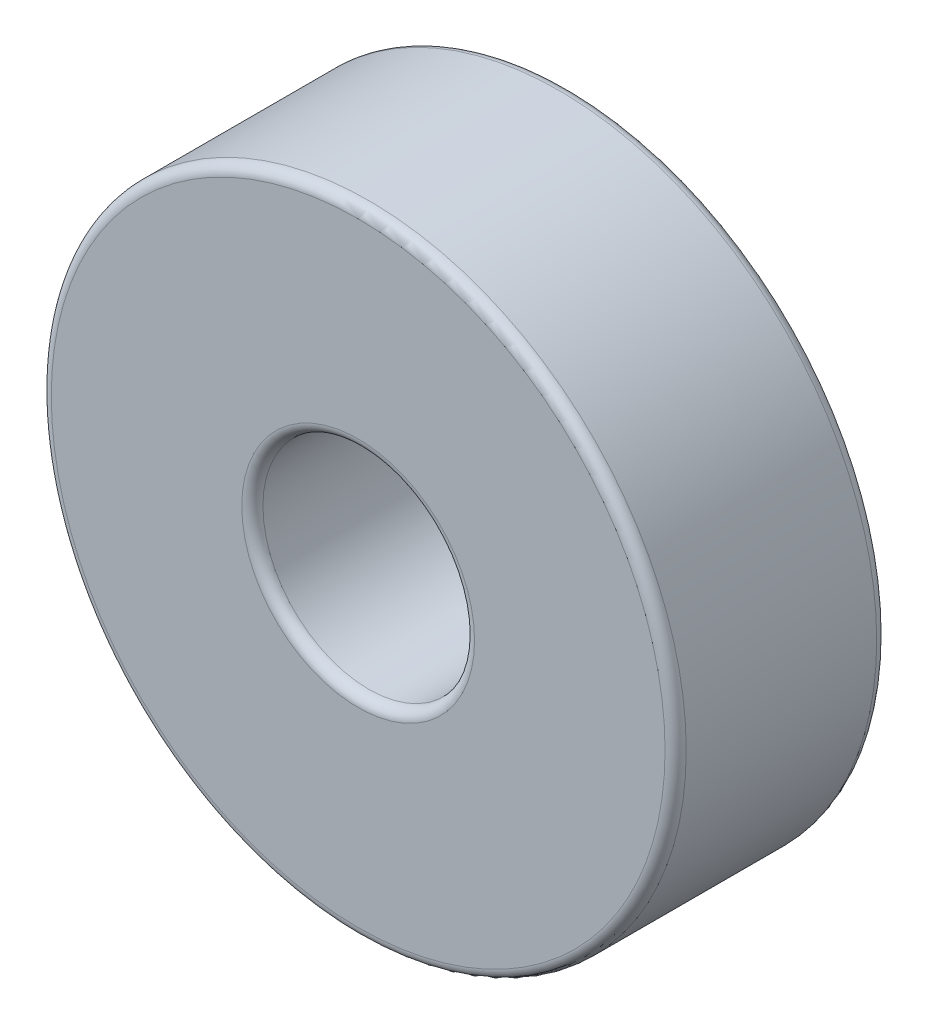
ISO-10303-21;
HEADER;
FILE_DESCRIPTION(('STEP AP214'),'2;1');
FILE_NAME('part.step','',(''),(''),'','','');
FILE_SCHEMA(('AUTOMOTIVE_DESIGN { 1 0 10303 214 1 1 1 1 }'));
ENDSEC;
DATA;
#1=APPLICATION_CONTEXT('core data for automotive mechanical design processes');
#2=APPLICATION_PROTOCOL_DEFINITION('international standard','automotive_design',2000,#1);
#3=PRODUCT_CONTEXT('',#1,'mechanical');
#4=PRODUCT('Part','Part','',(#3));
#5=PRODUCT_RELATED_PRODUCT_CATEGORY('part','',(#4));
#6=PRODUCT_DEFINITION_FORMATION('','',#4);
#7=PRODUCT_DEFINITION_CONTEXT('part definition',#1,'design');
#8=PRODUCT_DEFINITION('design','',#6,#7);
#9=PRODUCT_DEFINITION_SHAPE('','',#8);
#10=(LENGTH_UNIT() NAMED_UNIT(*) SI_UNIT(.MILLI.,.METRE.));
#11=(NAMED_UNIT(*) PLANE_ANGLE_UNIT() SI_UNIT($,.RADIAN.));
#12=(NAMED_UNIT(*) SI_UNIT($,.STERADIAN.) SOLID_ANGLE_UNIT());
#13=UNCERTAINTY_MEASURE_WITH_UNIT(LENGTH_MEASURE(1.E-05),#10,'distance_accuracy_value','');
#14=(GEOMETRIC_REPRESENTATION_CONTEXT(3) GLOBAL_UNCERTAINTY_ASSIGNED_CONTEXT((#13)) GLOBAL_UNIT_ASSIGNED_CONTEXT((#10,
#11,#12)) REPRESENTATION_CONTEXT('',''));
#15=CARTESIAN_POINT('',(0.,0.,0.));
#16=DIRECTION('',(0.,0.,1.));
#17=DIRECTION('',(1.,0.,0.));
#18=AXIS2_PLACEMENT_3D('',#15,#16,#17);
#19=CARTESIAN_POINT('',(0.,0.,3.));
#20=DIRECTION('',(0.,0.,1.));
#21=DIRECTION('',(1.,0.,0.));
#22=AXIS2_PLACEMENT_3D('',#19,#20,#21);
#23=PLANE('',#22);
#24=CARTESIAN_POINT('',(0.,0.,3.));
#25=DIRECTION('',(0.,0.,1.));
#26=DIRECTION('',(1.,0.,0.));
#27=AXIS2_PLACEMENT_3D('',#24,#25,#26);
#28=CIRCLE('',#27,1.65);
#29=CARTESIAN_POINT('',(1.65,0.,3.));
#30=VERTEX_POINT('',#29);
#31=EDGE_CURVE('E46',#30,#30,#28,.F.);
#32=ORIENTED_EDGE('',*,*,#31,.T.);
#33=EDGE_LOOP('',(#32));
#34=FACE_BOUND('',#33,.T.);
#35=CARTESIAN_POINT('',(0.,0.,3.));
#36=DIRECTION('',(0.,0.,1.));
#37=DIRECTION('',(1.,0.,0.));
#38=AXIS2_PLACEMENT_3D('',#35,#36,#37);
#39=CIRCLE('',#38,4.35);
#40=CARTESIAN_POINT('',(4.35,0.,3.));
#41=VERTEX_POINT('',#40);
#42=EDGE_CURVE('E50',#41,#41,#39,.T.);
#43=ORIENTED_EDGE('',*,*,#42,.T.);
#44=EDGE_LOOP('',(#43));
#45=FACE_BOUND('',#44,.T.);
#46=ADVANCED_FACE('F35',(#34,#45),#23,.T.);
#47=CARTESIAN_POINT('',(0.,0.,0.));
#48=DIRECTION('',(0.,0.,1.));
#49=DIRECTION('',(1.,0.,0.));
#50=AXIS2_PLACEMENT_3D('',#47,#48,#49);
#51=PLANE('',#50);
#52=CARTESIAN_POINT('',(0.,0.,0.));
#53=DIRECTION('',(0.,0.,1.));
#54=DIRECTION('',(1.,0.,0.));
#55=AXIS2_PLACEMENT_3D('',#52,#53,#54);
#56=CIRCLE('',#55,1.65);
#57=CARTESIAN_POINT('',(1.65,0.,0.));
#58=VERTEX_POINT('',#57);
#59=EDGE_CURVE('E61',#58,#58,#56,.T.);
#60=ORIENTED_EDGE('',*,*,#59,.T.);
#61=EDGE_LOOP('',(#60));
#62=FACE_BOUND('',#61,.T.);
#63=CARTESIAN_POINT('',(0.,0.,0.));
#64=DIRECTION('',(0.,0.,1.));
#65=DIRECTION('',(1.,0.,0.));
#66=AXIS2_PLACEMENT_3D('',#63,#64,#65);
#67=CIRCLE('',#66,4.35);
#68=CARTESIAN_POINT('',(4.35,0.,0.));
#69=VERTEX_POINT('',#68);
#70=EDGE_CURVE('E64',#69,#69,#67,.F.);
#71=ORIENTED_EDGE('',*,*,#70,.T.);
#72=EDGE_LOOP('',(#71));
#73=FACE_BOUND('',#72,.T.);
#74=ADVANCED_FACE('F68',(#62,#73),#51,.F.);
#75=CARTESIAN_POINT('',(0.,0.,3.));
#76=DIRECTION('',(0.,0.,-1.));
#77=DIRECTION('',(-1.,0.,0.));
#78=AXIS2_PLACEMENT_3D('',#75,#76,#77);
#79=CYLINDRICAL_SURFACE('',#78,4.5);
#80=CARTESIAN_POINT('',(0.,0.,0.15));
#81=DIRECTION('',(0.,0.,1.));
#82=DIRECTION('',(1.,0.,0.));
#83=AXIS2_PLACEMENT_3D('',#80,#81,#82);
#84=CIRCLE('',#83,4.5);
#85=CARTESIAN_POINT('',(4.5,0.,0.15));
#86=VERTEX_POINT('',#85);
#87=EDGE_CURVE('E10',#86,#86,#84,.T.);
#88=ORIENTED_EDGE('',*,*,#87,.T.);
#89=EDGE_LOOP('',(#88));
#90=FACE_BOUND('',#89,.T.);
#91=CARTESIAN_POINT('',(0.,0.,2.85));
#92=DIRECTION('',(0.,0.,1.));
#93=DIRECTION('',(1.,0.,0.));
#94=AXIS2_PLACEMENT_3D('',#91,#92,#93);
#95=CIRCLE('',#94,4.5);
#96=CARTESIAN_POINT('',(4.5,0.,2.85));
#97=VERTEX_POINT('',#96);
#98=EDGE_CURVE('E42',#97,#97,#95,.F.);
#99=ORIENTED_EDGE('',*,*,#98,.T.);
#100=EDGE_LOOP('',(#99));
#101=FACE_BOUND('',#100,.T.);
#102=ADVANCED_FACE('F88',(#90,#101),#79,.T.);
#103=CARTESIAN_POINT('',(0.,0.,3.));
#104=DIRECTION('',(0.,0.,-1.));
#105=DIRECTION('',(-1.,0.,0.));
#106=AXIS2_PLACEMENT_3D('',#103,#104,#105);
#107=CYLINDRICAL_SURFACE('',#106,1.5);
#108=CARTESIAN_POINT('',(0.,0.,0.15));
#109=DIRECTION('',(0.,0.,1.));
#110=DIRECTION('',(1.,0.,0.));
#111=AXIS2_PLACEMENT_3D('',#108,#109,#110);
#112=CIRCLE('',#111,1.5);
#113=CARTESIAN_POINT('',(1.5,0.,0.15));
#114=VERTEX_POINT('',#113);
#115=EDGE_CURVE('E55',#114,#114,#112,.F.);
#116=ORIENTED_EDGE('',*,*,#115,.T.);
#117=EDGE_LOOP('',(#116));
#118=FACE_BOUND('',#117,.T.);
#119=CARTESIAN_POINT('',(0.,0.,2.85));
#120=DIRECTION('',(0.,0.,1.));
#121=DIRECTION('',(1.,0.,0.));
#122=AXIS2_PLACEMENT_3D('',#119,#120,#121);
#123=CIRCLE('',#122,1.5);
#124=CARTESIAN_POINT('',(1.5,0.,2.85));
#125=VERTEX_POINT('',#124);
#126=EDGE_CURVE('E58',#125,#125,#123,.T.);
#127=ORIENTED_EDGE('',*,*,#126,.T.);
#128=EDGE_LOOP('',(#127));
#129=FACE_BOUND('',#128,.T.);
#130=ADVANCED_FACE('F93',(#118,#129),#107,.F.);
#131=CARTESIAN_POINT('',(0.,0.,0.15));
#132=DIRECTION('',(0.,0.,1.));
#133=DIRECTION('',(1.,0.,0.));
#134=AXIS2_PLACEMENT_3D('',#131,#132,#133);
#135=TOROIDAL_SURFACE('',#134,1.65,0.15);
#136=ORIENTED_EDGE('',*,*,#115,.F.);
#137=EDGE_LOOP('',(#136));
#138=FACE_BOUND('',#137,.T.);
#139=ORIENTED_EDGE('',*,*,#59,.F.);
#140=EDGE_LOOP('',(#139));
#141=FACE_BOUND('',#140,.T.);
#142=ADVANCED_FACE('F79',(#138,#141),#135,.T.);
#143=CARTESIAN_POINT('',(0.,0.,2.85));
#144=DIRECTION('',(0.,0.,1.));
#145=DIRECTION('',(1.,0.,0.));
#146=AXIS2_PLACEMENT_3D('',#143,#144,#145);
#147=TOROIDAL_SURFACE('',#146,1.65,0.15);
#148=ORIENTED_EDGE('',*,*,#31,.F.);
#149=EDGE_LOOP('',(#148));
#150=FACE_BOUND('',#149,.T.);
#151=ORIENTED_EDGE('',*,*,#126,.F.);
#152=EDGE_LOOP('',(#151));
#153=FACE_BOUND('',#152,.T.);
#154=ADVANCED_FACE('F73',(#150,#153),#147,.T.);
#155=CARTESIAN_POINT('',(0.,0.,0.15));
#156=DIRECTION('',(0.,0.,1.));
#157=DIRECTION('',(1.,0.,0.));
#158=AXIS2_PLACEMENT_3D('',#155,#156,#157);
#159=TOROIDAL_SURFACE('',#158,4.35,0.15);
#160=ORIENTED_EDGE('',*,*,#70,.F.);
#161=EDGE_LOOP('',(#160));
#162=FACE_BOUND('',#161,.T.);
#163=ORIENTED_EDGE('',*,*,#87,.F.);
#164=EDGE_LOOP('',(#163));
#165=FACE_BOUND('',#164,.T.);
#166=ADVANCED_FACE('F70',(#162,#165),#159,.T.);
#167=CARTESIAN_POINT('',(0.,0.,2.85));
#168=DIRECTION('',(0.,0.,1.));
#169=DIRECTION('',(1.,0.,0.));
#170=AXIS2_PLACEMENT_3D('',#167,#168,#169);
#171=TOROIDAL_SURFACE('',#170,4.35,0.15);
#172=ORIENTED_EDGE('',*,*,#98,.F.);
#173=EDGE_LOOP('',(#172));
#174=FACE_BOUND('',#173,.T.);
#175=ORIENTED_EDGE('',*,*,#42,.F.);
#176=EDGE_LOOP('',(#175));
#177=FACE_BOUND('',#176,.T.);
#178=ADVANCED_FACE('F37',(#174,#177),#171,.T.);
#179=CLOSED_SHELL('',(#46,#74,#102,#130,#142,#154,#166,#178));
#180=MANIFOLD_SOLID_BREP('B2',#179);
#181=ADVANCED_BREP_SHAPE_REPRESENTATION('',(#18,#180),#14);
#182=SHAPE_DEFINITION_REPRESENTATION(#9,#181);
ENDSEC;
END-ISO-10303-21;
